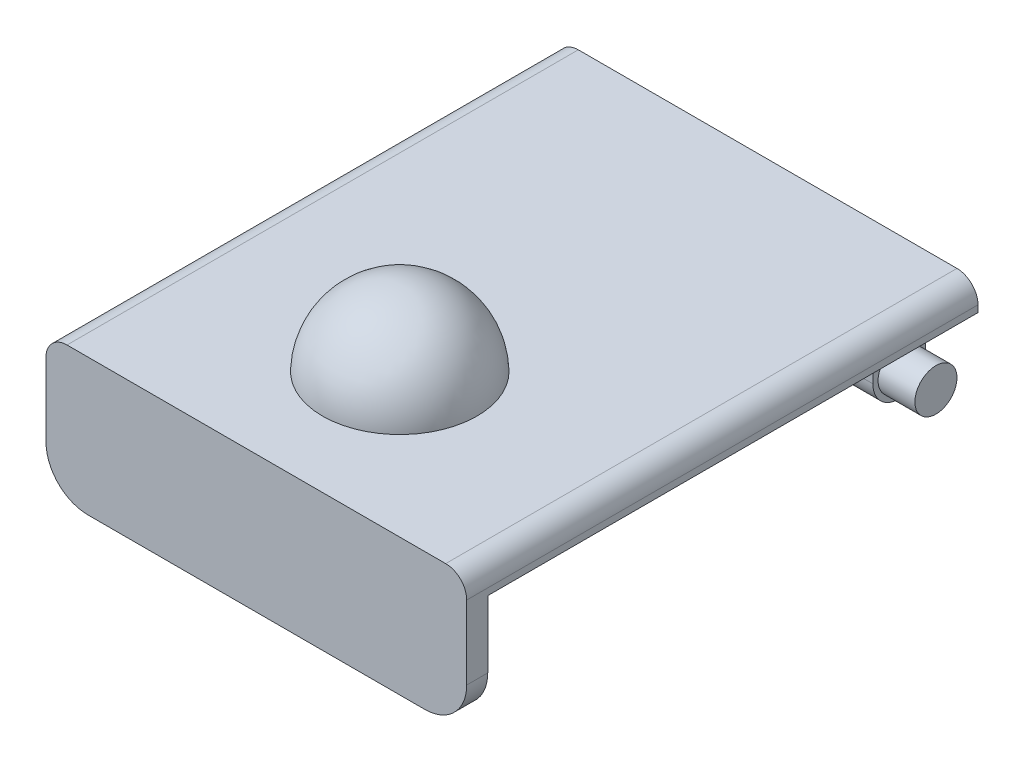
ISO-10303-21;
HEADER;
FILE_DESCRIPTION(('STEP AP214'),'2;1');
FILE_NAME('part.step','',(''),(''),'','','');
FILE_SCHEMA(('AUTOMOTIVE_DESIGN { 1 0 10303 214 1 1 1 1 }'));
ENDSEC;
DATA;
#1=APPLICATION_CONTEXT('core data for automotive mechanical design processes');
#2=APPLICATION_PROTOCOL_DEFINITION('international standard','automotive_design',2000,#1);
#3=PRODUCT_CONTEXT('',#1,'mechanical');
#4=PRODUCT('Part','Part','',(#3));
#5=PRODUCT_RELATED_PRODUCT_CATEGORY('part','',(#4));
#6=PRODUCT_DEFINITION_FORMATION('','',#4);
#7=PRODUCT_DEFINITION_CONTEXT('part definition',#1,'design');
#8=PRODUCT_DEFINITION('design','',#6,#7);
#9=PRODUCT_DEFINITION_SHAPE('','',#8);
#10=(LENGTH_UNIT() NAMED_UNIT(*) SI_UNIT(.MILLI.,.METRE.));
#11=(NAMED_UNIT(*) PLANE_ANGLE_UNIT() SI_UNIT($,.RADIAN.));
#12=(NAMED_UNIT(*) SI_UNIT($,.STERADIAN.) SOLID_ANGLE_UNIT());
#13=UNCERTAINTY_MEASURE_WITH_UNIT(LENGTH_MEASURE(1.E-05),#10,'distance_accuracy_value','');
#14=(GEOMETRIC_REPRESENTATION_CONTEXT(3) GLOBAL_UNCERTAINTY_ASSIGNED_CONTEXT((#13)) GLOBAL_UNIT_ASSIGNED_CONTEXT((#10,
#11,#12)) REPRESENTATION_CONTEXT('',''));
#15=CARTESIAN_POINT('',(0.,0.,0.));
#16=DIRECTION('',(0.,0.,1.));
#17=DIRECTION('',(1.,0.,0.));
#18=AXIS2_PLACEMENT_3D('',#15,#16,#17);
#19=CARTESIAN_POINT('',(139.080001475215,57.170001385808,-2.));
#20=DIRECTION('',(0.,0.,1.));
#21=DIRECTION('',(1.,0.,0.));
#22=AXIS2_PLACEMENT_3D('',#19,#20,#21);
#23=PLANE('',#22);
#24=DIRECTION('',(1.,0.,0.));
#25=VECTOR('',#24,1.);
#26=CARTESIAN_POINT('',(149.080001475215,61.0303815832172,-2.));
#27=LINE('',#26,#25);
#28=CARTESIAN_POINT('',(119.080001475215,61.0303815832172,-2.));
#29=VERTEX_POINT('',#28);
#30=CARTESIAN_POINT('',(159.080001475215,61.0303815832172,-2.));
#31=VERTEX_POINT('',#30);
#32=EDGE_CURVE('E307',#29,#31,#27,.T.);
#33=ORIENTED_EDGE('',*,*,#32,.T.);
#34=DIRECTION('',(0.,-1.,0.));
#35=VECTOR('',#34,1.);
#36=CARTESIAN_POINT('',(159.080001475215,61.670001385808,-2.));
#37=LINE('',#36,#35);
#38=CARTESIAN_POINT('',(159.080001475215,54.670001385808,-2.));
#39=VERTEX_POINT('',#38);
#40=EDGE_CURVE('E295',#31,#39,#37,.T.);
#41=ORIENTED_EDGE('',*,*,#40,.T.);
#42=CARTESIAN_POINT('',(155.080001475215,54.670001385808,-2.));
#43=DIRECTION('',(0.,0.,-1.));
#44=DIRECTION('',(0.,-1.,0.));
#45=AXIS2_PLACEMENT_3D('',#42,#43,#44);
#46=CIRCLE('',#45,4.);
#47=CARTESIAN_POINT('',(155.080001475215,50.670001385808,-2.));
#48=VERTEX_POINT('',#47);
#49=EDGE_CURVE('E40',#39,#48,#46,.T.);
#50=ORIENTED_EDGE('',*,*,#49,.T.);
#51=DIRECTION('',(-1.,0.,0.));
#52=VECTOR('',#51,1.);
#53=CARTESIAN_POINT('',(155.080001475215,50.670001385808,-2.));
#54=LINE('',#53,#52);
#55=CARTESIAN_POINT('',(123.080001475215,50.670001385808,-2.));
#56=VERTEX_POINT('',#55);
#57=EDGE_CURVE('E220',#48,#56,#54,.T.);
#58=ORIENTED_EDGE('',*,*,#57,.T.);
#59=CARTESIAN_POINT('',(123.080001475215,54.670001385808,-2.));
#60=DIRECTION('',(0.,0.,-1.));
#61=DIRECTION('',(-1.,0.,0.));
#62=AXIS2_PLACEMENT_3D('',#59,#60,#61);
#63=CIRCLE('',#62,4.);
#64=CARTESIAN_POINT('',(119.080001475215,54.670001385808,-2.));
#65=VERTEX_POINT('',#64);
#66=EDGE_CURVE('E212',#56,#65,#63,.T.);
#67=ORIENTED_EDGE('',*,*,#66,.T.);
#68=DIRECTION('',(0.,1.,0.));
#69=VECTOR('',#68,1.);
#70=CARTESIAN_POINT('',(119.080001475215,54.670001385808,-2.));
#71=LINE('',#70,#69);
#72=EDGE_CURVE('E296',#65,#29,#71,.T.);
#73=ORIENTED_EDGE('',*,*,#72,.T.);
#74=EDGE_LOOP('',(#33,#41,#50,#58,#67,#73));
#75=FACE_BOUND('',#74,.T.);
#76=ADVANCED_FACE('F16',(#75),#23,.F.);
#77=CARTESIAN_POINT('',(121.080001475215,61.670001385808,0.));
#78=DIRECTION('',(0.,0.,-1.));
#79=DIRECTION('',(0.,1.,0.));
#80=AXIS2_PLACEMENT_3D('',#77,#78,#79);
#81=CYLINDRICAL_SURFACE('',#80,2.);
#82=CARTESIAN_POINT('',(121.080001475215,61.670001385808,0.));
#83=DIRECTION('',(0.,0.,1.));
#84=DIRECTION('',(0.,1.,0.));
#85=AXIS2_PLACEMENT_3D('',#82,#83,#84);
#86=CIRCLE('',#85,2.);
#87=CARTESIAN_POINT('',(121.080001475215,63.670001385808,0.));
#88=VERTEX_POINT('',#87);
#89=CARTESIAN_POINT('',(119.080001475215,61.670001385808,0.));
#90=VERTEX_POINT('',#89);
#91=EDGE_CURVE('E300',#88,#90,#86,.T.);
#92=ORIENTED_EDGE('',*,*,#91,.F.);
#93=DIRECTION('',(0.,0.,-1.));
#94=VECTOR('',#93,1.);
#95=CARTESIAN_POINT('',(121.080001475215,63.670001385808,0.));
#96=LINE('',#95,#94);
#97=CARTESIAN_POINT('',(121.080001475215,63.670001385808,-48.61));
#98=VERTEX_POINT('',#97);
#99=EDGE_CURVE('E11',#88,#98,#96,.T.);
#100=ORIENTED_EDGE('',*,*,#99,.T.);
#101=CARTESIAN_POINT('',(121.080001475215,61.670001385808,-48.61));
#102=DIRECTION('',(0.,0.,-1.));
#103=DIRECTION('',(0.,1.,0.));
#104=AXIS2_PLACEMENT_3D('',#101,#102,#103);
#105=CIRCLE('',#104,2.);
#106=CARTESIAN_POINT('',(119.080001475215,61.670001385808,-48.61));
#107=VERTEX_POINT('',#106);
#108=EDGE_CURVE('E189',#107,#98,#105,.T.);
#109=ORIENTED_EDGE('',*,*,#108,.F.);
#110=DIRECTION('',(0.,0.,-1.));
#111=VECTOR('',#110,1.);
#112=CARTESIAN_POINT('',(119.080001475215,61.670001385808,0.));
#113=LINE('',#112,#111);
#114=EDGE_CURVE('E199',#90,#107,#113,.T.);
#115=ORIENTED_EDGE('',*,*,#114,.F.);
#116=EDGE_LOOP('',(#92,#100,#109,#115));
#117=FACE_BOUND('',#116,.T.);
#118=ADVANCED_FACE('F570',(#117),#81,.T.);
#119=CARTESIAN_POINT('',(121.080001475215,63.670001385808,0.));
#120=DIRECTION('',(0.,1.,0.));
#121=DIRECTION('',(1.,0.,0.));
#122=AXIS2_PLACEMENT_3D('',#119,#120,#121);
#123=PLANE('',#122);
#124=CARTESIAN_POINT('',(139.079774198243,63.670001385808,-13.6349235589248));
#125=DIRECTION('',(0.,-1.,0.));
#126=DIRECTION('',(0.,0.,-1.));
#127=AXIS2_PLACEMENT_3D('',#124,#125,#126);
#128=CIRCLE('',#127,7.34735700486182);
#129=CARTESIAN_POINT('',(139.079774198243,63.670001385808,-6.28756655406293));
#130=VERTEX_POINT('',#129);
#131=EDGE_CURVE('E216',#130,#130,#128,.T.);
#132=ORIENTED_EDGE('',*,*,#131,.T.);
#133=EDGE_LOOP('',(#132));
#134=FACE_BOUND('',#133,.T.);
#135=DIRECTION('',(1.,0.,0.));
#136=VECTOR('',#135,1.);
#137=CARTESIAN_POINT('',(121.080001475215,63.670001385808,0.));
#138=LINE('',#137,#136);
#139=CARTESIAN_POINT('',(157.080001475215,63.670001385808,0.));
#140=VERTEX_POINT('',#139);
#141=EDGE_CURVE('E175',#88,#140,#138,.T.);
#142=ORIENTED_EDGE('',*,*,#141,.T.);
#143=DIRECTION('',(0.,0.,-1.));
#144=VECTOR('',#143,1.);
#145=CARTESIAN_POINT('',(157.080001475215,63.670001385808,0.));
#146=LINE('',#145,#144);
#147=CARTESIAN_POINT('',(157.080001475215,63.670001385808,-48.61));
#148=VERTEX_POINT('',#147);
#149=EDGE_CURVE('E26',#140,#148,#146,.T.);
#150=ORIENTED_EDGE('',*,*,#149,.T.);
#151=DIRECTION('',(1.,0.,0.));
#152=VECTOR('',#151,1.);
#153=CARTESIAN_POINT('',(121.080001475215,63.670001385808,-48.61));
#154=LINE('',#153,#152);
#155=EDGE_CURVE('E172',#98,#148,#154,.T.);
#156=ORIENTED_EDGE('',*,*,#155,.F.);
#157=ORIENTED_EDGE('',*,*,#99,.F.);
#158=EDGE_LOOP('',(#142,#150,#156,#157));
#159=FACE_BOUND('',#158,.T.);
#160=ADVANCED_FACE('F170',(#134,#159),#123,.T.);
#161=CARTESIAN_POINT('',(157.080001475215,61.670001385808,0.));
#162=DIRECTION('',(0.,0.,-1.));
#163=DIRECTION('',(1.,0.,0.));
#164=AXIS2_PLACEMENT_3D('',#161,#162,#163);
#165=CYLINDRICAL_SURFACE('',#164,2.);
#166=CARTESIAN_POINT('',(157.080001475215,61.670001385808,0.));
#167=DIRECTION('',(0.,0.,1.));
#168=DIRECTION('',(1.,0.,0.));
#169=AXIS2_PLACEMENT_3D('',#166,#167,#168);
#170=CIRCLE('',#169,2.);
#171=CARTESIAN_POINT('',(159.080001475215,61.670001385808,0.));
#172=VERTEX_POINT('',#171);
#173=EDGE_CURVE('E228',#172,#140,#170,.T.);
#174=ORIENTED_EDGE('',*,*,#173,.F.);
#175=DIRECTION('',(0.,0.,-1.));
#176=VECTOR('',#175,1.);
#177=CARTESIAN_POINT('',(159.080001475215,61.670001385808,0.));
#178=LINE('',#177,#176);
#179=CARTESIAN_POINT('',(159.080001475215,61.670001385808,-48.61));
#180=VERTEX_POINT('',#179);
#181=EDGE_CURVE('E184',#172,#180,#178,.T.);
#182=ORIENTED_EDGE('',*,*,#181,.T.);
#183=CARTESIAN_POINT('',(157.080001475215,61.670001385808,-48.61));
#184=DIRECTION('',(0.,0.,-1.));
#185=DIRECTION('',(1.,0.,0.));
#186=AXIS2_PLACEMENT_3D('',#183,#184,#185);
#187=CIRCLE('',#186,2.);
#188=EDGE_CURVE('E181',#148,#180,#187,.T.);
#189=ORIENTED_EDGE('',*,*,#188,.F.);
#190=ORIENTED_EDGE('',*,*,#149,.F.);
#191=EDGE_LOOP('',(#174,#182,#189,#190));
#192=FACE_BOUND('',#191,.T.);
#193=ADVANCED_FACE('F182',(#192),#165,.T.);
#194=CARTESIAN_POINT('',(155.080001475215,54.670001385808,0.));
#195=DIRECTION('',(0.,0.,-1.));
#196=DIRECTION('',(0.,-1.,0.));
#197=AXIS2_PLACEMENT_3D('',#194,#195,#196);
#198=CYLINDRICAL_SURFACE('',#197,4.);
#199=CARTESIAN_POINT('',(155.080001475215,54.670001385808,0.));
#200=DIRECTION('',(0.,0.,1.));
#201=DIRECTION('',(0.,-1.,0.));
#202=AXIS2_PLACEMENT_3D('',#199,#200,#201);
#203=CIRCLE('',#202,4.);
#204=CARTESIAN_POINT('',(155.080001475215,50.670001385808,0.));
#205=VERTEX_POINT('',#204);
#206=CARTESIAN_POINT('',(159.080001475215,54.670001385808,0.));
#207=VERTEX_POINT('',#206);
#208=EDGE_CURVE('E230',#205,#207,#203,.T.);
#209=ORIENTED_EDGE('',*,*,#208,.F.);
#210=DIRECTION('',(0.,0.,-1.));
#211=VECTOR('',#210,1.);
#212=CARTESIAN_POINT('',(155.080001475215,50.670001385808,0.));
#213=LINE('',#212,#211);
#214=EDGE_CURVE('E223',#205,#48,#213,.T.);
#215=ORIENTED_EDGE('',*,*,#214,.T.);
#216=ORIENTED_EDGE('',*,*,#49,.F.);
#217=DIRECTION('',(0.,0.,-1.));
#218=VECTOR('',#217,1.);
#219=CARTESIAN_POINT('',(159.080001475215,54.670001385808,0.));
#220=LINE('',#219,#218);
#221=EDGE_CURVE('E236',#207,#39,#220,.T.);
#222=ORIENTED_EDGE('',*,*,#221,.F.);
#223=EDGE_LOOP('',(#209,#215,#216,#222));
#224=FACE_BOUND('',#223,.T.);
#225=ADVANCED_FACE('F520',(#224),#198,.T.);
#226=CARTESIAN_POINT('',(155.080001475215,50.670001385808,0.));
#227=DIRECTION('',(0.,-1.,0.));
#228=DIRECTION('',(-1.,0.,0.));
#229=AXIS2_PLACEMENT_3D('',#226,#227,#228);
#230=PLANE('',#229);
#231=DIRECTION('',(-1.,0.,0.));
#232=VECTOR('',#231,1.);
#233=CARTESIAN_POINT('',(155.080001475215,50.670001385808,0.));
#234=LINE('',#233,#232);
#235=CARTESIAN_POINT('',(123.080001475215,50.670001385808,0.));
#236=VERTEX_POINT('',#235);
#237=EDGE_CURVE('E245',#205,#236,#234,.T.);
#238=ORIENTED_EDGE('',*,*,#237,.T.);
#239=DIRECTION('',(0.,0.,-1.));
#240=VECTOR('',#239,1.);
#241=CARTESIAN_POINT('',(123.080001475215,50.670001385808,0.));
#242=LINE('',#241,#240);
#243=EDGE_CURVE('E215',#236,#56,#242,.T.);
#244=ORIENTED_EDGE('',*,*,#243,.T.);
#245=ORIENTED_EDGE('',*,*,#57,.F.);
#246=ORIENTED_EDGE('',*,*,#214,.F.);
#247=EDGE_LOOP('',(#238,#244,#245,#246));
#248=FACE_BOUND('',#247,.T.);
#249=ADVANCED_FACE('F524',(#248),#230,.T.);
#250=CARTESIAN_POINT('',(123.080001475215,54.670001385808,0.));
#251=DIRECTION('',(0.,0.,-1.));
#252=DIRECTION('',(-1.,0.,0.));
#253=AXIS2_PLACEMENT_3D('',#250,#251,#252);
#254=CYLINDRICAL_SURFACE('',#253,4.);
#255=CARTESIAN_POINT('',(123.080001475215,54.670001385808,0.));
#256=DIRECTION('',(0.,0.,1.));
#257=DIRECTION('',(-1.,0.,0.));
#258=AXIS2_PLACEMENT_3D('',#255,#256,#257);
#259=CIRCLE('',#258,4.);
#260=CARTESIAN_POINT('',(119.080001475215,54.670001385808,0.));
#261=VERTEX_POINT('',#260);
#262=EDGE_CURVE('E271',#261,#236,#259,.T.);
#263=ORIENTED_EDGE('',*,*,#262,.F.);
#264=DIRECTION('',(0.,0.,-1.));
#265=VECTOR('',#264,1.);
#266=CARTESIAN_POINT('',(119.080001475215,54.670001385808,0.));
#267=LINE('',#266,#265);
#268=EDGE_CURVE('E299',#261,#65,#267,.T.);
#269=ORIENTED_EDGE('',*,*,#268,.T.);
#270=ORIENTED_EDGE('',*,*,#66,.F.);
#271=ORIENTED_EDGE('',*,*,#243,.F.);
#272=EDGE_LOOP('',(#263,#269,#270,#271));
#273=FACE_BOUND('',#272,.T.);
#274=ADVANCED_FACE('F530',(#273),#254,.T.);
#275=CARTESIAN_POINT('',(119.080001475215,54.670001385808,0.));
#276=DIRECTION('',(-1.,0.,0.));
#277=DIRECTION('',(0.,0.,1.));
#278=AXIS2_PLACEMENT_3D('',#275,#276,#277);
#279=PLANE('',#278);
#280=ORIENTED_EDGE('',*,*,#72,.F.);
#281=ORIENTED_EDGE('',*,*,#268,.F.);
#282=DIRECTION('',(0.,1.,0.));
#283=VECTOR('',#282,1.);
#284=CARTESIAN_POINT('',(119.080001475215,54.670001385808,0.));
#285=LINE('',#284,#283);
#286=EDGE_CURVE('E268',#261,#90,#285,.T.);
#287=ORIENTED_EDGE('',*,*,#286,.T.);
#288=ORIENTED_EDGE('',*,*,#114,.T.);
#289=DIRECTION('',(0.,1.,0.));
#290=VECTOR('',#289,1.);
#291=CARTESIAN_POINT('',(119.080001475215,54.670001385808,-48.61));
#292=LINE('',#291,#290);
#293=CARTESIAN_POINT('',(119.080001475215,61.0303815832172,-48.61));
#294=VERTEX_POINT('',#293);
#295=EDGE_CURVE('E121',#294,#107,#292,.T.);
#296=ORIENTED_EDGE('',*,*,#295,.F.);
#297=DIRECTION('',(0.,0.,-1.));
#298=VECTOR('',#297,1.);
#299=CARTESIAN_POINT('',(119.080001475215,61.0303815832172,0.));
#300=LINE('',#299,#298);
#301=EDGE_CURVE('E281',#29,#294,#300,.T.);
#302=ORIENTED_EDGE('',*,*,#301,.F.);
#303=EDGE_LOOP('',(#280,#281,#287,#288,#296,#302));
#304=FACE_BOUND('',#303,.T.);
#305=ADVANCED_FACE('F532',(#304),#279,.T.);
#306=CARTESIAN_POINT('',(139.080001475215,57.170001385808,0.));
#307=DIRECTION('',(0.,0.,1.));
#308=DIRECTION('',(1.,0.,0.));
#309=AXIS2_PLACEMENT_3D('',#306,#307,#308);
#310=PLANE('',#309);
#311=ORIENTED_EDGE('',*,*,#286,.F.);
#312=ORIENTED_EDGE('',*,*,#262,.T.);
#313=ORIENTED_EDGE('',*,*,#237,.F.);
#314=ORIENTED_EDGE('',*,*,#208,.T.);
#315=DIRECTION('',(0.,-1.,0.));
#316=VECTOR('',#315,1.);
#317=CARTESIAN_POINT('',(159.080001475215,61.670001385808,0.));
#318=LINE('',#317,#316);
#319=EDGE_CURVE('E232',#172,#207,#318,.T.);
#320=ORIENTED_EDGE('',*,*,#319,.F.);
#321=ORIENTED_EDGE('',*,*,#173,.T.);
#322=ORIENTED_EDGE('',*,*,#141,.F.);
#323=ORIENTED_EDGE('',*,*,#91,.T.);
#324=EDGE_LOOP('',(#311,#312,#313,#314,#320,#321,#322,#323));
#325=FACE_BOUND('',#324,.T.);
#326=ADVANCED_FACE('F582',(#325),#310,.T.);
#327=CARTESIAN_POINT('',(159.080001475215,61.670001385808,0.));
#328=DIRECTION('',(1.,0.,0.));
#329=DIRECTION('',(0.,1.,0.));
#330=AXIS2_PLACEMENT_3D('',#327,#328,#329);
#331=PLANE('',#330);
#332=ORIENTED_EDGE('',*,*,#319,.T.);
#333=ORIENTED_EDGE('',*,*,#221,.T.);
#334=ORIENTED_EDGE('',*,*,#40,.F.);
#335=DIRECTION('',(0.,0.,-1.));
#336=VECTOR('',#335,1.);
#337=CARTESIAN_POINT('',(159.080001475215,61.0303815832172,0.));
#338=LINE('',#337,#336);
#339=CARTESIAN_POINT('',(159.080001475215,61.0303815832172,-48.61));
#340=VERTEX_POINT('',#339);
#341=EDGE_CURVE('E267',#31,#340,#338,.T.);
#342=ORIENTED_EDGE('',*,*,#341,.T.);
#343=DIRECTION('',(0.,-1.,0.));
#344=VECTOR('',#343,1.);
#345=CARTESIAN_POINT('',(159.080001475215,61.670001385808,-48.61));
#346=LINE('',#345,#344);
#347=EDGE_CURVE('E19',#180,#340,#346,.T.);
#348=ORIENTED_EDGE('',*,*,#347,.F.);
#349=ORIENTED_EDGE('',*,*,#181,.F.);
#350=EDGE_LOOP('',(#332,#333,#334,#342,#348,#349));
#351=FACE_BOUND('',#350,.T.);
#352=ADVANCED_FACE('F516',(#351),#331,.T.);
#353=CARTESIAN_POINT('',(139.080001475215,62.3501914845126,-48.61));
#354=DIRECTION('',(0.,0.,1.));
#355=DIRECTION('',(1.,0.,0.));
#356=AXIS2_PLACEMENT_3D('',#353,#354,#355);
#357=PLANE('',#356);
#358=DIRECTION('',(-1.,0.,0.));
#359=VECTOR('',#358,1.);
#360=CARTESIAN_POINT('',(119.080001475215,61.0303815832172,-48.61));
#361=LINE('',#360,#359);
#362=CARTESIAN_POINT('',(124.080001475215,61.0303815832172,-48.61));
#363=VERTEX_POINT('',#362);
#364=EDGE_CURVE('E219',#363,#294,#361,.T.);
#365=ORIENTED_EDGE('',*,*,#364,.T.);
#366=ORIENTED_EDGE('',*,*,#295,.T.);
#367=ORIENTED_EDGE('',*,*,#108,.T.);
#368=ORIENTED_EDGE('',*,*,#155,.T.);
#369=ORIENTED_EDGE('',*,*,#188,.T.);
#370=ORIENTED_EDGE('',*,*,#347,.T.);
#371=DIRECTION('',(-1.,0.,0.));
#372=VECTOR('',#371,1.);
#373=CARTESIAN_POINT('',(119.080001475215,61.0303815832172,-48.61));
#374=LINE('',#373,#372);
#375=CARTESIAN_POINT('',(154.080001475215,61.0303815832172,-48.61));
#376=VERTEX_POINT('',#375);
#377=EDGE_CURVE('E210',#340,#376,#374,.T.);
#378=ORIENTED_EDGE('',*,*,#377,.T.);
#379=DIRECTION('',(0.,-1.,0.));
#380=VECTOR('',#379,1.);
#381=CARTESIAN_POINT('',(154.080001475215,61.1001914845126,-48.61));
#382=LINE('',#381,#380);
#383=CARTESIAN_POINT('',(154.080001475215,55.170001385808,-48.61));
#384=VERTEX_POINT('',#383);
#385=EDGE_CURVE('E251',#376,#384,#382,.T.);
#386=ORIENTED_EDGE('',*,*,#385,.T.);
#387=DIRECTION('',(1.,0.,0.));
#388=VECTOR('',#387,1.);
#389=CARTESIAN_POINT('',(147.080001475215,55.170001385808,-48.61));
#390=LINE('',#389,#388);
#391=CARTESIAN_POINT('',(124.080001475215,55.170001385808,-48.61));
#392=VERTEX_POINT('',#391);
#393=EDGE_CURVE('E254',#392,#384,#390,.T.);
#394=ORIENTED_EDGE('',*,*,#393,.F.);
#395=DIRECTION('',(0.,1.,0.));
#396=VECTOR('',#395,1.);
#397=CARTESIAN_POINT('',(124.080001475215,57.920001385808,-48.61));
#398=LINE('',#397,#396);
#399=EDGE_CURVE('E241',#392,#363,#398,.T.);
#400=ORIENTED_EDGE('',*,*,#399,.T.);
#401=EDGE_LOOP('',(#365,#366,#367,#368,#369,#370,#378,#386,#394,#400));
#402=FACE_BOUND('',#401,.T.);
#403=ADVANCED_FACE('F188',(#402),#357,.F.);
#404=CARTESIAN_POINT('',(139.079774198243,63.4729099270688,-13.6349235589248));
#405=DIRECTION('',(0.,1.,0.));
#406=DIRECTION('',(0.,0.,-1.));
#407=AXIS2_PLACEMENT_3D('',#404,#405,#406);
#408=SPHERICAL_SURFACE('',#407,7.35);
#409=ORIENTED_EDGE('',*,*,#131,.F.);
#410=CARTESIAN_POINT('',(139.079774198243,63.4729099270688,-13.6349235589248));
#411=DIRECTION('',(1.,0.,0.));
#412=DIRECTION('',(0.,0.,1.));
#413=AXIS2_PLACEMENT_3D('',#410,#411,#412);
#414=CIRCLE('',#413,7.35);
#415=CARTESIAN_POINT('',(139.079774198243,70.8229099270688,-13.6349235589248));
#416=VERTEX_POINT('',#415);
#417=EDGE_CURVE('E132',#416,#130,#414,.T.);
#418=ORIENTED_EDGE('',*,*,#417,.F.);
#419=ORIENTED_EDGE('',*,*,#417,.T.);
#420=EDGE_LOOP('',(#409,#418,#419));
#421=FACE_BOUND('',#420,.T.);
#422=ADVANCED_FACE('F601',(#421),#408,.T.);
#423=CARTESIAN_POINT('',(159.080001475215,61.0303815832172,0.));
#424=DIRECTION('',(0.,-1.,0.));
#425=DIRECTION('',(0.,0.,-1.));
#426=AXIS2_PLACEMENT_3D('',#423,#424,#425);
#427=PLANE('',#426);
#428=DIRECTION('',(0.,0.,1.));
#429=VECTOR('',#428,1.);
#430=CARTESIAN_POINT('',(124.080001475215,61.0303815832172,-1.));
#431=LINE('',#430,#429);
#432=CARTESIAN_POINT('',(124.080001475215,61.0303815832172,-43.61));
#433=VERTEX_POINT('',#432);
#434=EDGE_CURVE('E237',#363,#433,#431,.T.);
#435=ORIENTED_EDGE('',*,*,#434,.T.);
#436=DIRECTION('',(1.,0.,0.));
#437=VECTOR('',#436,1.);
#438=CARTESIAN_POINT('',(149.080001475215,61.0303815832172,-43.61));
#439=LINE('',#438,#437);
#440=CARTESIAN_POINT('',(154.080001475215,61.0303815832172,-43.61));
#441=VERTEX_POINT('',#440);
#442=EDGE_CURVE('E207',#433,#441,#439,.T.);
#443=ORIENTED_EDGE('',*,*,#442,.T.);
#444=DIRECTION('',(0.,0.,-1.));
#445=VECTOR('',#444,1.);
#446=CARTESIAN_POINT('',(154.080001475215,61.0303815832172,-1.));
#447=LINE('',#446,#445);
#448=EDGE_CURVE('E206',#441,#376,#447,.T.);
#449=ORIENTED_EDGE('',*,*,#448,.T.);
#450=ORIENTED_EDGE('',*,*,#377,.F.);
#451=ORIENTED_EDGE('',*,*,#341,.F.);
#452=ORIENTED_EDGE('',*,*,#32,.F.);
#453=ORIENTED_EDGE('',*,*,#301,.T.);
#454=ORIENTED_EDGE('',*,*,#364,.F.);
#455=EDGE_LOOP('',(#435,#443,#449,#450,#451,#452,#453,#454));
#456=FACE_BOUND('',#455,.T.);
#457=ADVANCED_FACE('F371',(#456),#427,.T.);
#458=CARTESIAN_POINT('',(139.080001475215,59.170001385808,-43.61));
#459=DIRECTION('',(0.,0.,1.));
#460=DIRECTION('',(1.,0.,0.));
#461=AXIS2_PLACEMENT_3D('',#458,#459,#460);
#462=PLANE('',#461);
#463=ORIENTED_EDGE('',*,*,#442,.F.);
#464=DIRECTION('',(0.,1.,0.));
#465=VECTOR('',#464,1.);
#466=CARTESIAN_POINT('',(124.080001475215,57.920001385808,-43.61));
#467=LINE('',#466,#465);
#468=CARTESIAN_POINT('',(124.080001475215,55.170001385808,-43.61));
#469=VERTEX_POINT('',#468);
#470=EDGE_CURVE('E289',#469,#433,#467,.T.);
#471=ORIENTED_EDGE('',*,*,#470,.F.);
#472=DIRECTION('',(-1.,0.,0.));
#473=VECTOR('',#472,1.);
#474=CARTESIAN_POINT('',(147.080001475215,55.170001385808,-43.61));
#475=LINE('',#474,#473);
#476=CARTESIAN_POINT('',(154.080001475215,55.170001385808,-43.61));
#477=VERTEX_POINT('',#476);
#478=EDGE_CURVE('E211',#477,#469,#475,.T.);
#479=ORIENTED_EDGE('',*,*,#478,.F.);
#480=DIRECTION('',(0.,-1.,0.));
#481=VECTOR('',#480,1.);
#482=CARTESIAN_POINT('',(154.080001475215,61.1001914845126,-43.61));
#483=LINE('',#482,#481);
#484=EDGE_CURVE('E201',#441,#477,#483,.T.);
#485=ORIENTED_EDGE('',*,*,#484,.F.);
#486=EDGE_LOOP('',(#463,#471,#479,#485));
#487=FACE_BOUND('',#486,.T.);
#488=ADVANCED_FACE('F596',(#487),#462,.T.);
#489=CARTESIAN_POINT('',(147.080001475215,55.170001385808,-46.11));
#490=DIRECTION('',(-1.,0.,0.));
#491=DIRECTION('',(0.,-0.707106781186548,0.707106781186548));
#492=AXIS2_PLACEMENT_3D('',#489,#490,#491);
#493=CYLINDRICAL_SURFACE('',#492,2.5);
#494=CARTESIAN_POINT('',(124.080001475215,55.170001385808,-46.11));
#495=DIRECTION('',(1.,0.,0.));
#496=DIRECTION('',(0.,-0.707106781186548,-0.707106781186548));
#497=AXIS2_PLACEMENT_3D('',#494,#495,#496);
#498=CIRCLE('',#497,2.5);
#499=EDGE_CURVE('E329',#469,#392,#498,.T.);
#500=ORIENTED_EDGE('',*,*,#499,.T.);
#501=ORIENTED_EDGE('',*,*,#393,.T.);
#502=CARTESIAN_POINT('',(154.080001475215,55.170001385808,-46.11));
#503=DIRECTION('',(-1.,0.,0.));
#504=DIRECTION('',(0.,-0.707106781186548,0.707106781186548));
#505=AXIS2_PLACEMENT_3D('',#502,#503,#504);
#506=CIRCLE('',#505,2.5);
#507=EDGE_CURVE('E205',#384,#477,#506,.T.);
#508=ORIENTED_EDGE('',*,*,#507,.T.);
#509=ORIENTED_EDGE('',*,*,#478,.T.);
#510=EDGE_LOOP('',(#500,#501,#508,#509));
#511=FACE_BOUND('',#510,.T.);
#512=ADVANCED_FACE('F365',(#511),#493,.T.);
#513=CARTESIAN_POINT('',(124.080001475215,56.670001385808,-2.));
#514=DIRECTION('',(-1.,0.,0.));
#515=DIRECTION('',(0.,0.,1.));
#516=AXIS2_PLACEMENT_3D('',#513,#514,#515);
#517=PLANE('',#516);
#518=CARTESIAN_POINT('',(124.080001475215,55.170001385808,-46.11));
#519=DIRECTION('',(1.,0.,0.));
#520=DIRECTION('',(0.,0.,1.));
#521=AXIS2_PLACEMENT_3D('',#518,#519,#520);
#522=CIRCLE('',#521,2.);
#523=CARTESIAN_POINT('',(124.080001475215,55.170001385808,-48.11));
#524=VERTEX_POINT('',#523);
#525=EDGE_CURVE('E242',#524,#524,#522,.T.);
#526=ORIENTED_EDGE('',*,*,#525,.T.);
#527=EDGE_LOOP('',(#526));
#528=FACE_BOUND('',#527,.T.);
#529=ORIENTED_EDGE('',*,*,#434,.F.);
#530=ORIENTED_EDGE('',*,*,#399,.F.);
#531=ORIENTED_EDGE('',*,*,#499,.F.);
#532=ORIENTED_EDGE('',*,*,#470,.T.);
#533=EDGE_LOOP('',(#529,#530,#531,#532));
#534=FACE_BOUND('',#533,.T.);
#535=ADVANCED_FACE('F362',(#528,#534),#517,.T.);
#536=CARTESIAN_POINT('',(120.580001475215,55.170001385808,-46.11));
#537=DIRECTION('',(-1.,0.,0.));
#538=DIRECTION('',(0.,0.,1.));
#539=AXIS2_PLACEMENT_3D('',#536,#537,#538);
#540=PLANE('',#539);
#541=CARTESIAN_POINT('',(120.580001475215,55.170001385808,-46.11));
#542=DIRECTION('',(-1.,0.,0.));
#543=DIRECTION('',(0.,0.,1.));
#544=AXIS2_PLACEMENT_3D('',#541,#542,#543);
#545=CIRCLE('',#544,2.);
#546=CARTESIAN_POINT('',(120.580001475215,55.170001385808,-48.11));
#547=VERTEX_POINT('',#546);
#548=EDGE_CURVE('E258',#547,#547,#545,.T.);
#549=ORIENTED_EDGE('',*,*,#548,.T.);
#550=EDGE_LOOP('',(#549));
#551=FACE_BOUND('',#550,.T.);
#552=ADVANCED_FACE('F354',(#551),#540,.T.);
#553=CARTESIAN_POINT('',(122.330001475215,55.170001385808,-46.11));
#554=DIRECTION('',(-1.,0.,0.));
#555=DIRECTION('',(0.,0.,1.));
#556=AXIS2_PLACEMENT_3D('',#553,#554,#555);
#557=CYLINDRICAL_SURFACE('',#556,2.);
#558=ORIENTED_EDGE('',*,*,#548,.F.);
#559=DIRECTION('',(1.,0.,0.));
#560=VECTOR('',#559,1.);
#561=CARTESIAN_POINT('',(122.330001475215,55.170001385808,-48.11));
#562=LINE('',#561,#560);
#563=EDGE_CURVE('E255',#547,#524,#562,.T.);
#564=ORIENTED_EDGE('',*,*,#563,.T.);
#565=ORIENTED_EDGE('',*,*,#525,.F.);
#566=ORIENTED_EDGE('',*,*,#563,.F.);
#567=EDGE_LOOP('',(#558,#564,#565,#566));
#568=FACE_BOUND('',#567,.T.);
#569=ADVANCED_FACE('F359',(#568),#557,.T.);
#570=CARTESIAN_POINT('',(157.580001475215,55.170001385808,-46.11));
#571=DIRECTION('',(1.,0.,0.));
#572=DIRECTION('',(0.,0.,-1.));
#573=AXIS2_PLACEMENT_3D('',#570,#571,#572);
#574=PLANE('',#573);
#575=CARTESIAN_POINT('',(157.580001475215,55.170001385808,-46.11));
#576=DIRECTION('',(1.,0.,0.));
#577=DIRECTION('',(0.,0.,-1.));
#578=AXIS2_PLACEMENT_3D('',#575,#576,#577);
#579=CIRCLE('',#578,2.);
#580=CARTESIAN_POINT('',(157.580001475215,55.170001385808,-44.11));
#581=VERTEX_POINT('',#580);
#582=EDGE_CURVE('E250',#581,#581,#579,.T.);
#583=ORIENTED_EDGE('',*,*,#582,.T.);
#584=EDGE_LOOP('',(#583));
#585=FACE_BOUND('',#584,.T.);
#586=ADVANCED_FACE('F558',(#585),#574,.T.);
#587=CARTESIAN_POINT('',(155.830001475215,55.170001385808,-46.11));
#588=DIRECTION('',(1.,0.,0.));
#589=DIRECTION('',(0.,0.,-1.));
#590=AXIS2_PLACEMENT_3D('',#587,#588,#589);
#591=CYLINDRICAL_SURFACE('',#590,2.);
#592=ORIENTED_EDGE('',*,*,#582,.F.);
#593=DIRECTION('',(-1.,0.,0.));
#594=VECTOR('',#593,1.);
#595=CARTESIAN_POINT('',(155.830001475215,55.170001385808,-44.11));
#596=LINE('',#595,#594);
#597=CARTESIAN_POINT('',(154.080001475215,55.170001385808,-44.11));
#598=VERTEX_POINT('',#597);
#599=EDGE_CURVE('E314',#581,#598,#596,.T.);
#600=ORIENTED_EDGE('',*,*,#599,.T.);
#601=CARTESIAN_POINT('',(154.080001475215,55.170001385808,-46.11));
#602=DIRECTION('',(-1.,0.,0.));
#603=DIRECTION('',(0.,0.,-1.));
#604=AXIS2_PLACEMENT_3D('',#601,#602,#603);
#605=CIRCLE('',#604,2.);
#606=EDGE_CURVE('E246',#598,#598,#605,.T.);
#607=ORIENTED_EDGE('',*,*,#606,.F.);
#608=ORIENTED_EDGE('',*,*,#599,.F.);
#609=EDGE_LOOP('',(#592,#600,#607,#608));
#610=FACE_BOUND('',#609,.T.);
#611=ADVANCED_FACE('F556',(#610),#591,.T.);
#612=CARTESIAN_POINT('',(154.080001475215,63.0303815832172,-2.));
#613=DIRECTION('',(1.,0.,0.));
#614=DIRECTION('',(0.,1.,0.));
#615=AXIS2_PLACEMENT_3D('',#612,#613,#614);
#616=PLANE('',#615);
#617=ORIENTED_EDGE('',*,*,#606,.T.);
#618=EDGE_LOOP('',(#617));
#619=FACE_BOUND('',#618,.T.);
#620=ORIENTED_EDGE('',*,*,#448,.F.);
#621=ORIENTED_EDGE('',*,*,#484,.T.);
#622=ORIENTED_EDGE('',*,*,#507,.F.);
#623=ORIENTED_EDGE('',*,*,#385,.F.);
#624=EDGE_LOOP('',(#620,#621,#622,#623));
#625=FACE_BOUND('',#624,.T.);
#626=ADVANCED_FACE('F538',(#619,#625),#616,.T.);
#627=CLOSED_SHELL('',(#76,#118,#160,#193,#225,#249,#274,#305,#326,#352,#403,#422,#457,#488,#512,
#535,#552,#569,#586,#611,#626));
#628=MANIFOLD_SOLID_BREP('B1',#627);
#629=ADVANCED_BREP_SHAPE_REPRESENTATION('',(#18,#628),#14);
#630=SHAPE_DEFINITION_REPRESENTATION(#9,#629);
ENDSEC;
END-ISO-10303-21;
